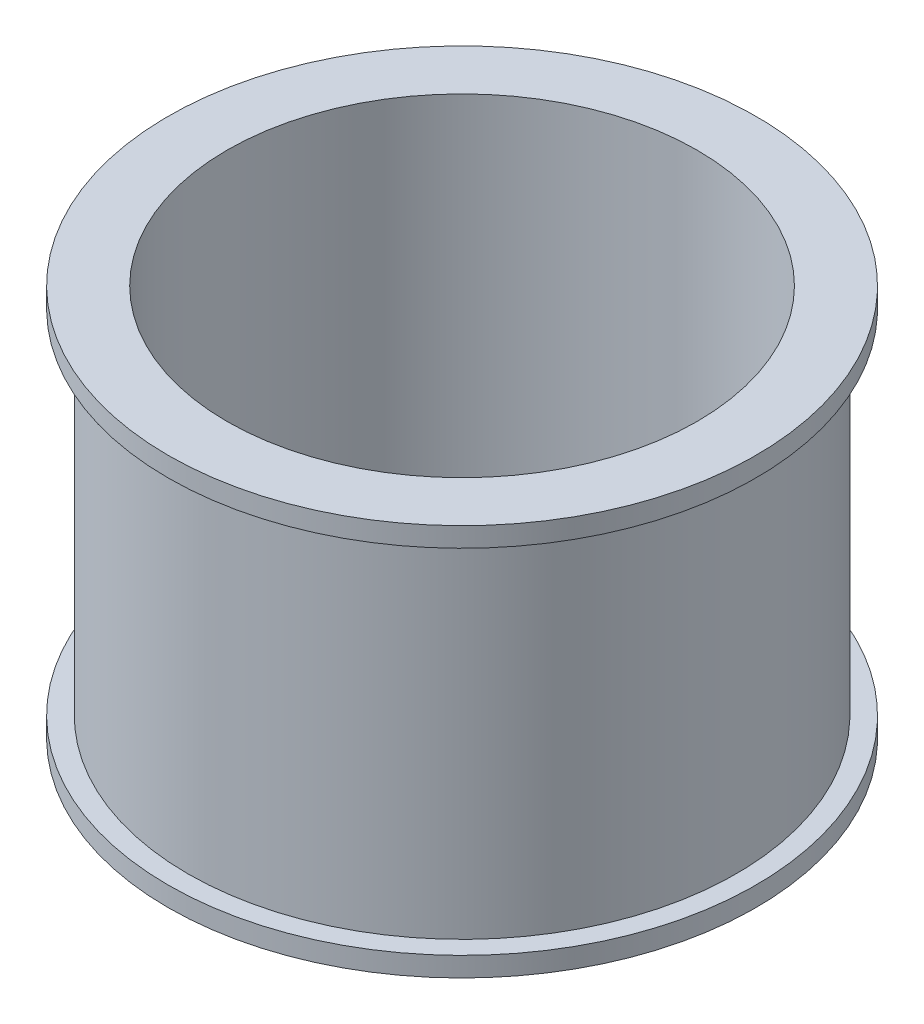
ISO-10303-21;
HEADER;
FILE_DESCRIPTION(('STEP AP214'),'2;1');
FILE_NAME('part.step','',(''),(''),'','','');
FILE_SCHEMA(('AUTOMOTIVE_DESIGN { 1 0 10303 214 1 1 1 1 }'));
ENDSEC;
DATA;
#1=APPLICATION_CONTEXT('core data for automotive mechanical design processes');
#2=APPLICATION_PROTOCOL_DEFINITION('international standard','automotive_design',2000,#1);
#3=PRODUCT_CONTEXT('',#1,'mechanical');
#4=PRODUCT('Part','Part','',(#3));
#5=PRODUCT_RELATED_PRODUCT_CATEGORY('part','',(#4));
#6=PRODUCT_DEFINITION_FORMATION('','',#4);
#7=PRODUCT_DEFINITION_CONTEXT('part definition',#1,'design');
#8=PRODUCT_DEFINITION('design','',#6,#7);
#9=PRODUCT_DEFINITION_SHAPE('','',#8);
#10=(LENGTH_UNIT() NAMED_UNIT(*) SI_UNIT(.MILLI.,.METRE.));
#11=(NAMED_UNIT(*) PLANE_ANGLE_UNIT() SI_UNIT($,.RADIAN.));
#12=(NAMED_UNIT(*) SI_UNIT($,.STERADIAN.) SOLID_ANGLE_UNIT());
#13=UNCERTAINTY_MEASURE_WITH_UNIT(LENGTH_MEASURE(1.E-05),#10,'distance_accuracy_value','');
#14=(GEOMETRIC_REPRESENTATION_CONTEXT(3) GLOBAL_UNCERTAINTY_ASSIGNED_CONTEXT((#13)) GLOBAL_UNIT_ASSIGNED_CONTEXT((#10,
#11,#12)) REPRESENTATION_CONTEXT('',''));
#15=CARTESIAN_POINT('',(0.,0.,0.));
#16=DIRECTION('',(0.,0.,1.));
#17=DIRECTION('',(1.,0.,0.));
#18=AXIS2_PLACEMENT_3D('',#15,#16,#17);
#19=CARTESIAN_POINT('',(0.,5.,0.));
#20=DIRECTION('',(0.,-1.,0.));
#21=DIRECTION('',(0.,0.,-1.));
#22=AXIS2_PLACEMENT_3D('',#19,#20,#21);
#23=CYLINDRICAL_SURFACE('',#22,3.5);
#24=CARTESIAN_POINT('',(0.,4.75,0.));
#25=DIRECTION('',(0.,1.,0.));
#26=DIRECTION('',(0.,0.,1.));
#27=AXIS2_PLACEMENT_3D('',#24,#25,#26);
#28=CIRCLE('',#27,3.5);
#29=CARTESIAN_POINT('',(0.,4.75,3.5));
#30=VERTEX_POINT('',#29);
#31=EDGE_CURVE('E44',#30,#30,#28,.T.);
#32=ORIENTED_EDGE('',*,*,#31,.F.);
#33=EDGE_LOOP('',(#32));
#34=FACE_BOUND('',#33,.T.);
#35=CARTESIAN_POINT('',(0.,0.25,0.));
#36=DIRECTION('',(0.,-1.,0.));
#37=DIRECTION('',(0.,0.,-1.));
#38=AXIS2_PLACEMENT_3D('',#35,#36,#37);
#39=CIRCLE('',#38,3.5);
#40=CARTESIAN_POINT('',(0.,0.25,-3.5));
#41=VERTEX_POINT('',#40);
#42=EDGE_CURVE('E10',#41,#41,#39,.T.);
#43=ORIENTED_EDGE('',*,*,#42,.F.);
#44=EDGE_LOOP('',(#43));
#45=FACE_BOUND('',#44,.T.);
#46=ADVANCED_FACE('F37',(#34,#45),#23,.T.);
#47=CARTESIAN_POINT('',(0.,5.,0.));
#48=DIRECTION('',(0.,1.,0.));
#49=DIRECTION('',(0.,0.,1.));
#50=AXIS2_PLACEMENT_3D('',#47,#48,#49);
#51=PLANE('',#50);
#52=CARTESIAN_POINT('',(0.,5.,0.));
#53=DIRECTION('',(0.,1.,0.));
#54=DIRECTION('',(0.,0.,1.));
#55=AXIS2_PLACEMENT_3D('',#52,#53,#54);
#56=CIRCLE('',#55,3.);
#57=CARTESIAN_POINT('',(0.,5.,3.));
#58=VERTEX_POINT('',#57);
#59=EDGE_CURVE('E54',#58,#58,#56,.T.);
#60=ORIENTED_EDGE('',*,*,#59,.F.);
#61=EDGE_LOOP('',(#60));
#62=FACE_BOUND('',#61,.T.);
#63=CARTESIAN_POINT('',(0.,5.,0.));
#64=DIRECTION('',(0.,1.,0.));
#65=DIRECTION('',(0.,0.,1.));
#66=AXIS2_PLACEMENT_3D('',#63,#64,#65);
#67=CIRCLE('',#66,3.75);
#68=CARTESIAN_POINT('',(0.,5.,3.75));
#69=VERTEX_POINT('',#68);
#70=EDGE_CURVE('E61',#69,#69,#67,.T.);
#71=ORIENTED_EDGE('',*,*,#70,.T.);
#72=EDGE_LOOP('',(#71));
#73=FACE_BOUND('',#72,.T.);
#74=ADVANCED_FACE('F88',(#62,#73),#51,.T.);
#75=CARTESIAN_POINT('',(0.,0.,0.));
#76=DIRECTION('',(0.,1.,0.));
#77=DIRECTION('',(0.,0.,1.));
#78=AXIS2_PLACEMENT_3D('',#75,#76,#77);
#79=PLANE('',#78);
#80=CARTESIAN_POINT('',(0.,0.,0.));
#81=DIRECTION('',(0.,1.,0.));
#82=DIRECTION('',(0.,0.,1.));
#83=AXIS2_PLACEMENT_3D('',#80,#81,#82);
#84=CIRCLE('',#83,3.);
#85=CARTESIAN_POINT('',(0.,0.,3.));
#86=VERTEX_POINT('',#85);
#87=EDGE_CURVE('E49',#86,#86,#84,.T.);
#88=ORIENTED_EDGE('',*,*,#87,.T.);
#89=EDGE_LOOP('',(#88));
#90=FACE_BOUND('',#89,.T.);
#91=CARTESIAN_POINT('',(0.,0.,0.));
#92=DIRECTION('',(0.,1.,0.));
#93=DIRECTION('',(0.,0.,1.));
#94=AXIS2_PLACEMENT_3D('',#91,#92,#93);
#95=CIRCLE('',#94,3.75);
#96=CARTESIAN_POINT('',(0.,0.,3.75));
#97=VERTEX_POINT('',#96);
#98=EDGE_CURVE('E69',#97,#97,#95,.T.);
#99=ORIENTED_EDGE('',*,*,#98,.F.);
#100=EDGE_LOOP('',(#99));
#101=FACE_BOUND('',#100,.T.);
#102=ADVANCED_FACE('F85',(#90,#101),#79,.F.);
#103=CARTESIAN_POINT('',(0.,-5.,0.));
#104=DIRECTION('',(0.,1.,0.));
#105=DIRECTION('',(0.,0.,1.));
#106=AXIS2_PLACEMENT_3D('',#103,#104,#105);
#107=CYLINDRICAL_SURFACE('',#106,3.);
#108=ORIENTED_EDGE('',*,*,#59,.T.);
#109=EDGE_LOOP('',(#108));
#110=FACE_BOUND('',#109,.T.);
#111=ORIENTED_EDGE('',*,*,#87,.F.);
#112=EDGE_LOOP('',(#111));
#113=FACE_BOUND('',#112,.T.);
#114=ADVANCED_FACE('F87',(#110,#113),#107,.F.);
#115=CARTESIAN_POINT('',(0.,4.75,0.));
#116=DIRECTION('',(0.,1.,0.));
#117=DIRECTION('',(0.,0.,1.));
#118=AXIS2_PLACEMENT_3D('',#115,#116,#117);
#119=CYLINDRICAL_SURFACE('',#118,3.75);
#120=CARTESIAN_POINT('',(0.,4.75,0.));
#121=DIRECTION('',(0.,1.,0.));
#122=DIRECTION('',(0.,0.,1.));
#123=AXIS2_PLACEMENT_3D('',#120,#121,#122);
#124=CIRCLE('',#123,3.75);
#125=CARTESIAN_POINT('',(0.,4.75,3.75));
#126=VERTEX_POINT('',#125);
#127=EDGE_CURVE('E60',#126,#126,#124,.T.);
#128=ORIENTED_EDGE('',*,*,#127,.T.);
#129=EDGE_LOOP('',(#128));
#130=FACE_BOUND('',#129,.T.);
#131=ORIENTED_EDGE('',*,*,#70,.F.);
#132=EDGE_LOOP('',(#131));
#133=FACE_BOUND('',#132,.T.);
#134=ADVANCED_FACE('F94',(#130,#133),#119,.T.);
#135=CARTESIAN_POINT('',(0.,4.75,0.));
#136=DIRECTION('',(0.,1.,0.));
#137=DIRECTION('',(0.,0.,1.));
#138=AXIS2_PLACEMENT_3D('',#135,#136,#137);
#139=PLANE('',#138);
#140=ORIENTED_EDGE('',*,*,#31,.T.);
#141=EDGE_LOOP('',(#140));
#142=FACE_BOUND('',#141,.T.);
#143=ORIENTED_EDGE('',*,*,#127,.F.);
#144=EDGE_LOOP('',(#143));
#145=FACE_BOUND('',#144,.T.);
#146=ADVANCED_FACE('F121',(#142,#145),#139,.F.);
#147=CARTESIAN_POINT('',(0.,0.25,0.));
#148=DIRECTION('',(0.,-1.,0.));
#149=DIRECTION('',(0.,0.,1.));
#150=AXIS2_PLACEMENT_3D('',#147,#148,#149);
#151=PLANE('',#150);
#152=CARTESIAN_POINT('',(0.,0.25,0.));
#153=DIRECTION('',(0.,1.,0.));
#154=DIRECTION('',(0.,0.,1.));
#155=AXIS2_PLACEMENT_3D('',#152,#153,#154);
#156=CIRCLE('',#155,3.75);
#157=CARTESIAN_POINT('',(0.,0.25,3.75));
#158=VERTEX_POINT('',#157);
#159=EDGE_CURVE('E65',#158,#158,#156,.T.);
#160=ORIENTED_EDGE('',*,*,#159,.T.);
#161=EDGE_LOOP('',(#160));
#162=FACE_BOUND('',#161,.T.);
#163=ORIENTED_EDGE('',*,*,#42,.T.);
#164=EDGE_LOOP('',(#163));
#165=FACE_BOUND('',#164,.T.);
#166=ADVANCED_FACE('F77',(#162,#165),#151,.F.);
#167=CARTESIAN_POINT('',(0.,0.25,0.));
#168=DIRECTION('',(0.,-1.,0.));
#169=DIRECTION('',(0.,0.,-1.));
#170=AXIS2_PLACEMENT_3D('',#167,#168,#169);
#171=CYLINDRICAL_SURFACE('',#170,3.75);
#172=ORIENTED_EDGE('',*,*,#159,.F.);
#173=EDGE_LOOP('',(#172));
#174=FACE_BOUND('',#173,.T.);
#175=ORIENTED_EDGE('',*,*,#98,.T.);
#176=EDGE_LOOP('',(#175));
#177=FACE_BOUND('',#176,.T.);
#178=ADVANCED_FACE('F79',(#174,#177),#171,.T.);
#179=CLOSED_SHELL('',(#46,#74,#102,#114,#134,#146,#166,#178));
#180=MANIFOLD_SOLID_BREP('B2',#179);
#181=ADVANCED_BREP_SHAPE_REPRESENTATION('',(#18,#180),#14);
#182=SHAPE_DEFINITION_REPRESENTATION(#9,#181);
ENDSEC;
END-ISO-10303-21;
